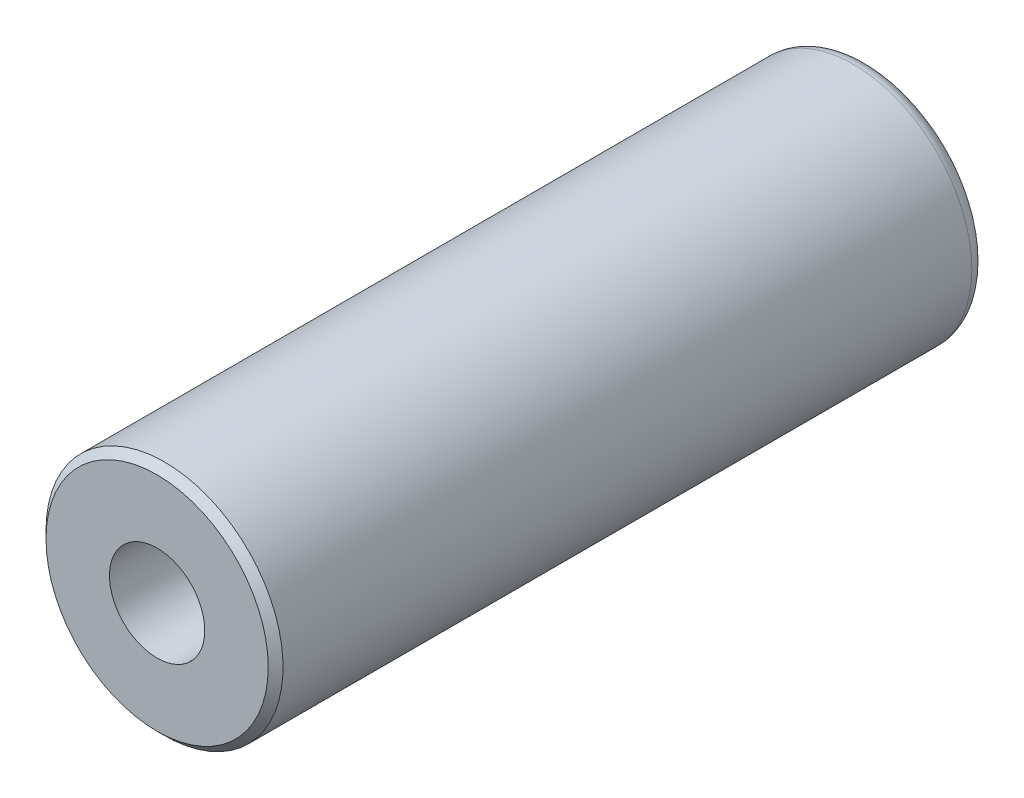
ISO-10303-21;
HEADER;
FILE_DESCRIPTION(('STEP AP214'),'2;1');
FILE_NAME('part.step','',(''),(''),'','','');
FILE_SCHEMA(('AUTOMOTIVE_DESIGN { 1 0 10303 214 1 1 1 1 }'));
ENDSEC;
DATA;
#1=APPLICATION_CONTEXT('core data for automotive mechanical design processes');
#2=APPLICATION_PROTOCOL_DEFINITION('international standard','automotive_design',2000,#1);
#3=PRODUCT_CONTEXT('',#1,'mechanical');
#4=PRODUCT('Part','Part','',(#3));
#5=PRODUCT_RELATED_PRODUCT_CATEGORY('part','',(#4));
#6=PRODUCT_DEFINITION_FORMATION('','',#4);
#7=PRODUCT_DEFINITION_CONTEXT('part definition',#1,'design');
#8=PRODUCT_DEFINITION('design','',#6,#7);
#9=PRODUCT_DEFINITION_SHAPE('','',#8);
#10=(LENGTH_UNIT() NAMED_UNIT(*) SI_UNIT(.MILLI.,.METRE.));
#11=(NAMED_UNIT(*) PLANE_ANGLE_UNIT() SI_UNIT($,.RADIAN.));
#12=(NAMED_UNIT(*) SI_UNIT($,.STERADIAN.) SOLID_ANGLE_UNIT());
#13=UNCERTAINTY_MEASURE_WITH_UNIT(LENGTH_MEASURE(1.E-05),#10,'distance_accuracy_value','');
#14=(GEOMETRIC_REPRESENTATION_CONTEXT(3) GLOBAL_UNCERTAINTY_ASSIGNED_CONTEXT((#13)) GLOBAL_UNIT_ASSIGNED_CONTEXT((#10,
#11,#12)) REPRESENTATION_CONTEXT('',''));
#15=CARTESIAN_POINT('',(0.,0.,0.));
#16=DIRECTION('',(0.,0.,1.));
#17=DIRECTION('',(1.,0.,0.));
#18=AXIS2_PLACEMENT_3D('',#15,#16,#17);
#19=CARTESIAN_POINT('',(0.,0.,38.1));
#20=DIRECTION('',(0.,0.,-1.));
#21=DIRECTION('',(-1.,0.,0.));
#22=AXIS2_PLACEMENT_3D('',#19,#20,#21);
#23=CYLINDRICAL_SURFACE('',#22,6.35);
#24=CARTESIAN_POINT('',(0.,0.,0.793750000000003));
#25=DIRECTION('',(0.,0.,1.));
#26=DIRECTION('',(1.,0.,0.));
#27=AXIS2_PLACEMENT_3D('',#24,#25,#26);
#28=CIRCLE('',#27,6.35);
#29=CARTESIAN_POINT('',(-6.35,0.,0.793749999999996));
#30=VERTEX_POINT('',#29);
#31=EDGE_CURVE('E42',#30,#30,#28,.T.);
#32=CARTESIAN_POINT('',(0.,0.,37.703125));
#33=DIRECTION('',(0.,0.,1.));
#34=DIRECTION('',(1.,0.,0.));
#35=AXIS2_PLACEMENT_3D('',#32,#33,#34);
#36=CIRCLE('',#35,6.35);
#37=CARTESIAN_POINT('',(-6.35,0.,37.703125));
#38=VERTEX_POINT('',#37);
#39=EDGE_CURVE('E59',#38,#38,#36,.F.);
#40=CARTESIAN_POINT('',(-6.35,0.,0.793749999999996));
#41=CARTESIAN_POINT('',(-6.35,0.,1.17822265625));
#42=CARTESIAN_POINT('',(-6.35,0.,1.5626953125));
#43=CARTESIAN_POINT('',(-6.35,0.,2.331640625));
#44=CARTESIAN_POINT('',(-6.35,0.,2.71611328125));
#45=CARTESIAN_POINT('',(-6.35,0.,3.48505859375));
#46=CARTESIAN_POINT('',(-6.35,0.,3.86953125));
#47=CARTESIAN_POINT('',(-6.35,0.,4.6384765625));
#48=CARTESIAN_POINT('',(-6.35,0.,5.02294921875));
#49=CARTESIAN_POINT('',(-6.35,0.,5.79189453125));
#50=CARTESIAN_POINT('',(-6.35,0.,6.1763671875));
#51=CARTESIAN_POINT('',(-6.35,0.,6.94531250000001));
#52=CARTESIAN_POINT('',(-6.35,0.,7.32978515625));
#53=CARTESIAN_POINT('',(-6.35,0.,8.09873046875));
#54=CARTESIAN_POINT('',(-6.35,0.,8.483203125));
#55=CARTESIAN_POINT('',(-6.35,0.,9.2521484375));
#56=CARTESIAN_POINT('',(-6.35,0.,9.63662109375));
#57=CARTESIAN_POINT('',(-6.35,0.,10.40556640625));
#58=CARTESIAN_POINT('',(-6.35,0.,10.7900390625));
#59=CARTESIAN_POINT('',(-6.35,0.,11.558984375));
#60=CARTESIAN_POINT('',(-6.35,0.,11.94345703125));
#61=CARTESIAN_POINT('',(-6.35,0.,12.71240234375));
#62=CARTESIAN_POINT('',(-6.35,0.,13.096875));
#63=CARTESIAN_POINT('',(-6.35,0.,13.8658203125));
#64=CARTESIAN_POINT('',(-6.35,0.,14.25029296875));
#65=CARTESIAN_POINT('',(-6.35,0.,15.01923828125));
#66=CARTESIAN_POINT('',(-6.35,0.,15.4037109375));
#67=CARTESIAN_POINT('',(-6.35,0.,16.17265625));
#68=CARTESIAN_POINT('',(-6.35,0.,16.55712890625));
#69=CARTESIAN_POINT('',(-6.35,0.,17.32607421875));
#70=CARTESIAN_POINT('',(-6.35,0.,17.710546875));
#71=CARTESIAN_POINT('',(-6.35,0.,18.4794921875));
#72=CARTESIAN_POINT('',(-6.35,0.,18.86396484375));
#73=CARTESIAN_POINT('',(-6.35,0.,19.63291015625));
#74=CARTESIAN_POINT('',(-6.35,0.,20.0173828125));
#75=CARTESIAN_POINT('',(-6.35,0.,20.786328125));
#76=CARTESIAN_POINT('',(-6.35,0.,21.17080078125));
#77=CARTESIAN_POINT('',(-6.35,0.,21.93974609375));
#78=CARTESIAN_POINT('',(-6.35,0.,22.32421875));
#79=CARTESIAN_POINT('',(-6.35,0.,23.0931640625));
#80=CARTESIAN_POINT('',(-6.35,0.,23.47763671875));
#81=CARTESIAN_POINT('',(-6.35,0.,24.24658203125));
#82=CARTESIAN_POINT('',(-6.35,0.,24.6310546875));
#83=CARTESIAN_POINT('',(-6.35,0.,25.4));
#84=CARTESIAN_POINT('',(-6.35,0.,25.78447265625));
#85=CARTESIAN_POINT('',(-6.35,0.,26.55341796875));
#86=CARTESIAN_POINT('',(-6.35,0.,26.937890625));
#87=CARTESIAN_POINT('',(-6.35,0.,27.7068359375));
#88=CARTESIAN_POINT('',(-6.35,0.,28.09130859375));
#89=CARTESIAN_POINT('',(-6.35,0.,28.86025390625));
#90=CARTESIAN_POINT('',(-6.35,0.,29.2447265625));
#91=CARTESIAN_POINT('',(-6.35,0.,30.013671875));
#92=CARTESIAN_POINT('',(-6.35,0.,30.39814453125));
#93=CARTESIAN_POINT('',(-6.35,0.,31.16708984375));
#94=CARTESIAN_POINT('',(-6.35,0.,31.5515625));
#95=CARTESIAN_POINT('',(-6.35,0.,32.3205078125));
#96=CARTESIAN_POINT('',(-6.35,0.,32.70498046875));
#97=CARTESIAN_POINT('',(-6.35,0.,33.47392578125));
#98=CARTESIAN_POINT('',(-6.35,0.,33.8583984375));
#99=CARTESIAN_POINT('',(-6.35,0.,34.62734375));
#100=CARTESIAN_POINT('',(-6.35,0.,35.01181640625));
#101=CARTESIAN_POINT('',(-6.35,0.,35.78076171875));
#102=CARTESIAN_POINT('',(-6.35,0.,36.165234375));
#103=CARTESIAN_POINT('',(-6.35,0.,36.9341796875));
#104=CARTESIAN_POINT('',(-6.35,0.,37.31865234375));
#105=CARTESIAN_POINT('',(-6.35,0.,37.703125));
#106=B_SPLINE_CURVE_WITH_KNOTS('',3,(#40,#41,#42,#43,#44,#45,#46,#47,#48,#49,#50,#51,#52,#53,
#54,#55,#56,#57,#58,#59,#60,#61,#62,#63,#64,#65,#66,#67,#68,#69,#70,#71,#72,#73,#74,#75,#76,#77,
#78,#79,#80,#81,#82,#83,#84,#85,#86,#87,#88,#89,#90,#91,#92,#93,#94,#95,#96,#97,#98,#99,#100,
#101,#102,#103,#104,#105),.UNSPECIFIED.,.F.,.F.,(4,2,2,2,2,2,2,2,2,2,2,2,2,2,2,2,2,2,2,2,2,2,2,
2,2,2,2,2,2,2,2,2,4),(0.,1.15341796875,2.3068359375,3.46025390625,4.613671875,5.76708984375001,
6.92050781250001,8.07392578125001,9.22734375000001,10.38076171875,11.5341796875,12.68759765625,
13.841015625,14.99443359375,16.1478515625,17.30126953125,18.4546875,19.60810546875,
20.7615234375,21.91494140625,23.068359375,24.22177734375,25.3751953125,26.52861328125,
27.68203125,28.83544921875,29.9888671875,31.14228515625,32.295703125,33.44912109375,
34.6025390625,35.75595703125,36.909375),.UNSPECIFIED.);
#107=EDGE_CURVE('BSEAM36',#30,#38,#106,.T.);
#108=ORIENTED_EDGE('',*,*,#31,.T.);
#109=ORIENTED_EDGE('',*,*,#39,.T.);
#110=ORIENTED_EDGE('',*,*,#107,.T.);
#111=ORIENTED_EDGE('',*,*,#107,.F.);
#112=EDGE_LOOP('',(#108,#110,#109,#111));
#113=FACE_BOUND('',#112,.T.);
#114=ADVANCED_FACE('F36',(#113),#23,.T.);
#115=CARTESIAN_POINT('',(0.,0.,38.1));
#116=DIRECTION('',(0.,0.,1.));
#117=DIRECTION('',(1.,0.,0.));
#118=AXIS2_PLACEMENT_3D('',#115,#116,#117);
#119=PLANE('',#118);
#120=CARTESIAN_POINT('',(0.,0.,38.1));
#121=DIRECTION('',(0.,0.,1.));
#122=DIRECTION('',(1.,0.,0.));
#123=AXIS2_PLACEMENT_3D('',#120,#121,#122);
#124=CIRCLE('',#123,5.95312500000003);
#125=CARTESIAN_POINT('',(5.95312500000003,0.,38.1));
#126=VERTEX_POINT('',#125);
#127=EDGE_CURVE('E55',#126,#126,#124,.T.);
#128=ORIENTED_EDGE('',*,*,#127,.T.);
#129=EDGE_LOOP('',(#128));
#130=FACE_BOUND('',#129,.T.);
#131=CARTESIAN_POINT('',(0.,0.,38.1));
#132=DIRECTION('',(0.,0.,1.));
#133=DIRECTION('',(1.,0.,0.));
#134=AXIS2_PLACEMENT_3D('',#131,#132,#133);
#135=CIRCLE('',#134,2.55269999999999);
#136=CARTESIAN_POINT('',(2.55269999999999,0.,38.1));
#137=VERTEX_POINT('',#136);
#138=EDGE_CURVE('E56',#137,#137,#135,.T.);
#139=ORIENTED_EDGE('',*,*,#138,.F.);
#140=EDGE_LOOP('',(#139));
#141=FACE_BOUND('',#140,.T.);
#142=ADVANCED_FACE('F82',(#130,#141),#119,.T.);
#143=CARTESIAN_POINT('',(0.,0.,0.));
#144=DIRECTION('',(0.,0.,1.));
#145=DIRECTION('',(1.,0.,0.));
#146=AXIS2_PLACEMENT_3D('',#143,#144,#145);
#147=PLANE('',#146);
#148=CARTESIAN_POINT('',(0.,0.,0.));
#149=DIRECTION('',(0.,0.,1.));
#150=DIRECTION('',(1.,0.,0.));
#151=AXIS2_PLACEMENT_3D('',#148,#149,#150);
#152=CIRCLE('',#151,5.55625);
#153=CARTESIAN_POINT('',(5.55625,0.,0.));
#154=VERTEX_POINT('',#153);
#155=EDGE_CURVE('E11',#154,#154,#152,.F.);
#156=ORIENTED_EDGE('',*,*,#155,.T.);
#157=EDGE_LOOP('',(#156));
#158=FACE_BOUND('',#157,.T.);
#159=ADVANCED_FACE('F49',(#158),#147,.F.);
#160=CARTESIAN_POINT('',(0.,0.,21.59));
#161=DIRECTION('',(0.,0.,1.));
#162=DIRECTION('',(1.,0.,0.));
#163=AXIS2_PLACEMENT_3D('',#160,#161,#162);
#164=CONICAL_SURFACE('',#163,2.55269999999999,1.02974425867665);
#165=CARTESIAN_POINT('',(0.,0.,20.0561830978084));
#166=VERTEX_POINT('',#165);
#167=VERTEX_LOOP('',#166);
#168=FACE_BOUND('',#167,.T.);
#169=CARTESIAN_POINT('',(0.,0.,21.59));
#170=DIRECTION('',(0.,0.,1.));
#171=DIRECTION('',(1.,0.,0.));
#172=AXIS2_PLACEMENT_3D('',#169,#170,#171);
#173=CIRCLE('',#172,2.55269999999999);
#174=CARTESIAN_POINT('',(2.55269999999999,0.,21.59));
#175=VERTEX_POINT('',#174);
#176=EDGE_CURVE('E53',#175,#175,#173,.T.);
#177=ORIENTED_EDGE('',*,*,#176,.T.);
#178=EDGE_LOOP('',(#177));
#179=FACE_BOUND('',#178,.T.);
#180=ADVANCED_FACE('F45',(#168,#179),#164,.F.);
#181=CARTESIAN_POINT('',(0.,0.,38.1));
#182=DIRECTION('',(0.,0.,1.));
#183=DIRECTION('',(1.,0.,0.));
#184=AXIS2_PLACEMENT_3D('',#181,#182,#183);
#185=CYLINDRICAL_SURFACE('',#184,2.55269999999999);
#186=ORIENTED_EDGE('',*,*,#176,.F.);
#187=EDGE_LOOP('',(#186));
#188=FACE_BOUND('',#187,.T.);
#189=ORIENTED_EDGE('',*,*,#138,.T.);
#190=EDGE_LOOP('',(#189));
#191=FACE_BOUND('',#190,.T.);
#192=ADVANCED_FACE('F48',(#188,#191),#185,.F.);
#193=CARTESIAN_POINT('',(0.,0.,38.1));
#194=DIRECTION('',(0.,0.,-1.));
#195=DIRECTION('',(-1.,0.,0.));
#196=AXIS2_PLACEMENT_3D('',#193,#194,#195);
#197=CONICAL_SURFACE('',#196,5.95312500000003,0.785398163397456);
#198=ORIENTED_EDGE('',*,*,#39,.F.);
#199=EDGE_LOOP('',(#198));
#200=FACE_BOUND('',#199,.T.);
#201=ORIENTED_EDGE('',*,*,#127,.F.);
#202=EDGE_LOOP('',(#201));
#203=FACE_BOUND('',#202,.T.);
#204=ADVANCED_FACE('F72',(#200,#203),#197,.T.);
#205=CARTESIAN_POINT('',(0.,0.,0.793750000000003));
#206=DIRECTION('',(0.,0.,1.));
#207=DIRECTION('',(1.,0.,0.));
#208=AXIS2_PLACEMENT_3D('',#205,#206,#207);
#209=TOROIDAL_SURFACE('',#208,5.55625,0.79375);
#210=ORIENTED_EDGE('',*,*,#155,.F.);
#211=EDGE_LOOP('',(#210));
#212=FACE_BOUND('',#211,.T.);
#213=ORIENTED_EDGE('',*,*,#31,.F.);
#214=EDGE_LOOP('',(#213));
#215=FACE_BOUND('',#214,.T.);
#216=ADVANCED_FACE('F70',(#212,#215),#209,.T.);
#217=CLOSED_SHELL('',(#114,#142,#159,#180,#192,#204,#216));
#218=MANIFOLD_SOLID_BREP('B2',#217);
#219=ADVANCED_BREP_SHAPE_REPRESENTATION('',(#18,#218),#14);
#220=SHAPE_DEFINITION_REPRESENTATION(#9,#219);
ENDSEC;
END-ISO-10303-21;
